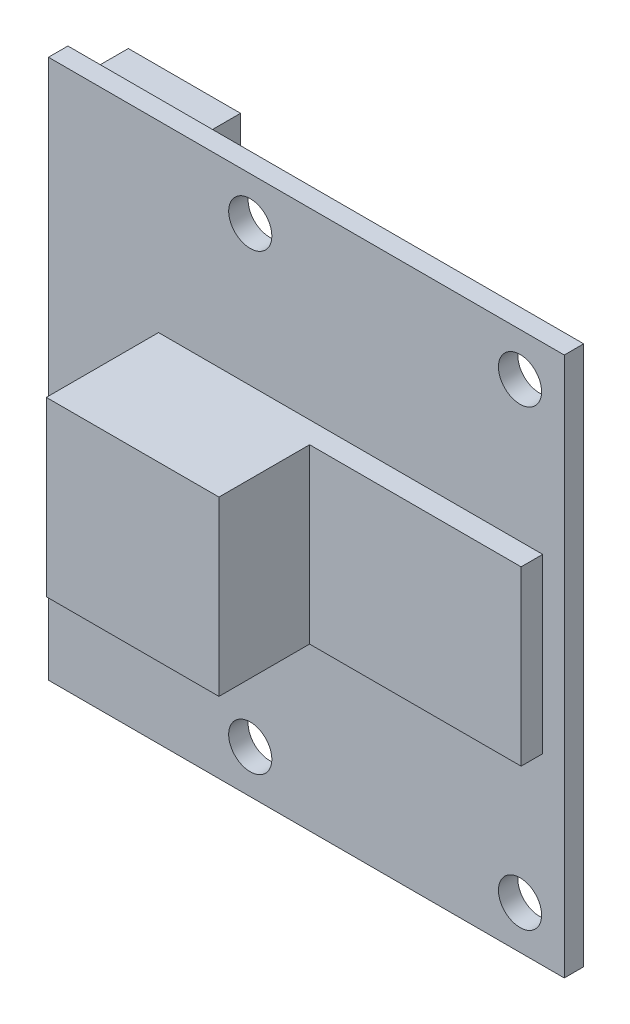
ISO-10303-21;
HEADER;
FILE_DESCRIPTION(('STEP AP214'),'2;1');
FILE_NAME('part.step','',(''),(''),'','','');
FILE_SCHEMA(('AUTOMOTIVE_DESIGN { 1 0 10303 214 1 1 1 1 }'));
ENDSEC;
DATA;
#1=APPLICATION_CONTEXT('core data for automotive mechanical design processes');
#2=APPLICATION_PROTOCOL_DEFINITION('international standard','automotive_design',2000,#1);
#3=PRODUCT_CONTEXT('',#1,'mechanical');
#4=PRODUCT('Part','Part','',(#3));
#5=PRODUCT_RELATED_PRODUCT_CATEGORY('part','',(#4));
#6=PRODUCT_DEFINITION_FORMATION('','',#4);
#7=PRODUCT_DEFINITION_CONTEXT('part definition',#1,'design');
#8=PRODUCT_DEFINITION('design','',#6,#7);
#9=PRODUCT_DEFINITION_SHAPE('','',#8);
#10=(LENGTH_UNIT() NAMED_UNIT(*) SI_UNIT(.MILLI.,.METRE.));
#11=(NAMED_UNIT(*) PLANE_ANGLE_UNIT() SI_UNIT($,.RADIAN.));
#12=(NAMED_UNIT(*) SI_UNIT($,.STERADIAN.) SOLID_ANGLE_UNIT());
#13=UNCERTAINTY_MEASURE_WITH_UNIT(LENGTH_MEASURE(1.E-05),#10,'distance_accuracy_value','');
#14=(GEOMETRIC_REPRESENTATION_CONTEXT(3) GLOBAL_UNCERTAINTY_ASSIGNED_CONTEXT((#13)) GLOBAL_UNIT_ASSIGNED_CONTEXT((#10,
#11,#12)) REPRESENTATION_CONTEXT('',''));
#15=CARTESIAN_POINT('',(0.,0.,0.));
#16=DIRECTION('',(0.,0.,1.));
#17=DIRECTION('',(1.,0.,0.));
#18=AXIS2_PLACEMENT_3D('',#15,#16,#17);
#19=CARTESIAN_POINT('',(0.,0.,0.));
#20=DIRECTION('',(0.,0.,1.));
#21=DIRECTION('',(1.,0.,0.));
#22=AXIS2_PLACEMENT_3D('',#19,#20,#21);
#23=PLANE('',#22);
#24=CARTESIAN_POINT('',(-2.15,-10.5,0.));
#25=DIRECTION('',(0.,0.,1.));
#26=DIRECTION('',(1.,0.,0.));
#27=AXIS2_PLACEMENT_3D('',#24,#25,#26);
#28=CIRCLE('',#27,0.999999999999993);
#29=CARTESIAN_POINT('',(-1.15000000000001,-10.5,0.));
#30=VERTEX_POINT('',#29);
#31=EDGE_CURVE('E544',#30,#30,#28,.T.);
#32=ORIENTED_EDGE('',*,*,#31,.T.);
#33=EDGE_LOOP('',(#32));
#34=FACE_BOUND('',#33,.T.);
#35=CARTESIAN_POINT('',(10.35,-10.5,0.));
#36=DIRECTION('',(0.,0.,1.));
#37=DIRECTION('',(1.,0.,0.));
#38=AXIS2_PLACEMENT_3D('',#35,#36,#37);
#39=CIRCLE('',#38,0.999999999999993);
#40=CARTESIAN_POINT('',(11.35,-10.5,0.));
#41=VERTEX_POINT('',#40);
#42=EDGE_CURVE('E163',#41,#41,#39,.T.);
#43=ORIENTED_EDGE('',*,*,#42,.T.);
#44=EDGE_LOOP('',(#43));
#45=FACE_BOUND('',#44,.T.);
#46=CARTESIAN_POINT('',(-2.15,10.5,0.));
#47=DIRECTION('',(0.,0.,1.));
#48=DIRECTION('',(1.,0.,0.));
#49=AXIS2_PLACEMENT_3D('',#46,#47,#48);
#50=CIRCLE('',#49,0.999999999999993);
#51=CARTESIAN_POINT('',(-1.15000000000001,10.5,0.));
#52=VERTEX_POINT('',#51);
#53=EDGE_CURVE('E198',#52,#52,#50,.T.);
#54=ORIENTED_EDGE('',*,*,#53,.T.);
#55=EDGE_LOOP('',(#54));
#56=FACE_BOUND('',#55,.T.);
#57=CARTESIAN_POINT('',(10.35,10.5,0.));
#58=DIRECTION('',(0.,0.,1.));
#59=DIRECTION('',(1.,0.,0.));
#60=AXIS2_PLACEMENT_3D('',#57,#58,#59);
#61=CIRCLE('',#60,0.999999999999993);
#62=CARTESIAN_POINT('',(11.35,10.5,0.));
#63=VERTEX_POINT('',#62);
#64=EDGE_CURVE('E204',#63,#63,#61,.T.);
#65=ORIENTED_EDGE('',*,*,#64,.T.);
#66=EDGE_LOOP('',(#65));
#67=FACE_BOUND('',#66,.T.);
#68=DIRECTION('',(1.,0.,0.));
#69=VECTOR('',#68,1.);
#70=CARTESIAN_POINT('',(-11.5,-11.,0.));
#71=LINE('',#70,#69);
#72=CARTESIAN_POINT('',(-11.5,-11.,0.));
#73=VERTEX_POINT('',#72);
#74=CARTESIAN_POINT('',(-6.3,-11.,0.));
#75=VERTEX_POINT('',#74);
#76=EDGE_CURVE('E160',#73,#75,#71,.T.);
#77=ORIENTED_EDGE('',*,*,#76,.T.);
#78=DIRECTION('',(0.,-1.,0.));
#79=VECTOR('',#78,1.);
#80=CARTESIAN_POINT('',(-6.3,0.,0.));
#81=LINE('',#80,#79);
#82=CARTESIAN_POINT('',(-6.3,11.,0.));
#83=VERTEX_POINT('',#82);
#84=EDGE_CURVE('E151',#83,#75,#81,.T.);
#85=ORIENTED_EDGE('',*,*,#84,.F.);
#86=DIRECTION('',(1.,0.,0.));
#87=VECTOR('',#86,1.);
#88=CARTESIAN_POINT('',(-11.5,11.,0.));
#89=LINE('',#88,#87);
#90=CARTESIAN_POINT('',(-11.5,11.,0.));
#91=VERTEX_POINT('',#90);
#92=EDGE_CURVE('E207',#91,#83,#89,.T.);
#93=ORIENTED_EDGE('',*,*,#92,.F.);
#94=DIRECTION('',(0.,-1.,0.));
#95=VECTOR('',#94,1.);
#96=CARTESIAN_POINT('',(-11.5,12.5,0.));
#97=LINE('',#96,#95);
#98=CARTESIAN_POINT('',(-11.5,12.5,0.));
#99=VERTEX_POINT('',#98);
#100=EDGE_CURVE('E232',#99,#91,#97,.T.);
#101=ORIENTED_EDGE('',*,*,#100,.F.);
#102=DIRECTION('',(-1.,0.,0.));
#103=VECTOR('',#102,1.);
#104=CARTESIAN_POINT('',(12.4,12.5,0.));
#105=LINE('',#104,#103);
#106=CARTESIAN_POINT('',(12.4,12.5,0.));
#107=VERTEX_POINT('',#106);
#108=EDGE_CURVE('E246',#107,#99,#105,.T.);
#109=ORIENTED_EDGE('',*,*,#108,.F.);
#110=DIRECTION('',(0.,1.,0.));
#111=VECTOR('',#110,1.);
#112=CARTESIAN_POINT('',(12.4,0.,0.));
#113=LINE('',#112,#111);
#114=CARTESIAN_POINT('',(12.4,-12.5,0.));
#115=VERTEX_POINT('',#114);
#116=EDGE_CURVE('E273',#115,#107,#113,.T.);
#117=ORIENTED_EDGE('',*,*,#116,.F.);
#118=DIRECTION('',(-1.,0.,0.));
#119=VECTOR('',#118,1.);
#120=CARTESIAN_POINT('',(12.4,-12.5,0.));
#121=LINE('',#120,#119);
#122=CARTESIAN_POINT('',(-11.5,-12.5,0.));
#123=VERTEX_POINT('',#122);
#124=EDGE_CURVE('E188',#115,#123,#121,.T.);
#125=ORIENTED_EDGE('',*,*,#124,.T.);
#126=DIRECTION('',(0.,1.,0.));
#127=VECTOR('',#126,1.);
#128=CARTESIAN_POINT('',(-11.5,-12.5,0.));
#129=LINE('',#128,#127);
#130=EDGE_CURVE('E183',#123,#73,#129,.T.);
#131=ORIENTED_EDGE('',*,*,#130,.T.);
#132=EDGE_LOOP('',(#77,#85,#93,#101,#109,#117,#125,#131));
#133=FACE_BOUND('',#132,.T.);
#134=ADVANCED_FACE('F32',(#34,#45,#56,#67,#133),#23,.F.);
#135=CARTESIAN_POINT('',(0.,0.,1.9));
#136=DIRECTION('',(0.,0.,-1.));
#137=DIRECTION('',(-1.,0.,0.));
#138=AXIS2_PLACEMENT_3D('',#135,#136,#137);
#139=PLANE('',#138);
#140=DIRECTION('',(0.,1.,0.));
#141=VECTOR('',#140,1.);
#142=CARTESIAN_POINT('',(1.6,0.,1.9));
#143=LINE('',#142,#141);
#144=CARTESIAN_POINT('',(1.6,-4.,1.9));
#145=VERTEX_POINT('',#144);
#146=CARTESIAN_POINT('',(1.6,4.,1.9));
#147=VERTEX_POINT('',#146);
#148=EDGE_CURVE('E235',#145,#147,#143,.T.);
#149=ORIENTED_EDGE('',*,*,#148,.F.);
#150=DIRECTION('',(-1.,0.,0.));
#151=VECTOR('',#150,1.);
#152=CARTESIAN_POINT('',(-6.4,-4.,1.9));
#153=LINE('',#152,#151);
#154=CARTESIAN_POINT('',(11.4,-4.,1.9));
#155=VERTEX_POINT('',#154);
#156=EDGE_CURVE('E174',#155,#145,#153,.T.);
#157=ORIENTED_EDGE('',*,*,#156,.F.);
#158=DIRECTION('',(0.,1.,0.));
#159=VECTOR('',#158,1.);
#160=CARTESIAN_POINT('',(11.4,4.,1.9));
#161=LINE('',#160,#159);
#162=CARTESIAN_POINT('',(11.4,4.,1.9));
#163=VERTEX_POINT('',#162);
#164=EDGE_CURVE('E262',#155,#163,#161,.T.);
#165=ORIENTED_EDGE('',*,*,#164,.T.);
#166=DIRECTION('',(-1.,0.,0.));
#167=VECTOR('',#166,1.);
#168=CARTESIAN_POINT('',(-6.4,4.,1.9));
#169=LINE('',#168,#167);
#170=EDGE_CURVE('E263',#163,#147,#169,.T.);
#171=ORIENTED_EDGE('',*,*,#170,.T.);
#172=EDGE_LOOP('',(#149,#157,#165,#171));
#173=FACE_BOUND('',#172,.T.);
#174=ADVANCED_FACE('F297',(#173),#139,.F.);
#175=CARTESIAN_POINT('',(12.4,0.,0.9));
#176=DIRECTION('',(-1.,0.,0.));
#177=DIRECTION('',(0.,-1.,0.));
#178=AXIS2_PLACEMENT_3D('',#175,#176,#177);
#179=PLANE('',#178);
#180=ORIENTED_EDGE('',*,*,#116,.T.);
#181=DIRECTION('',(0.,0.,-1.));
#182=VECTOR('',#181,1.);
#183=CARTESIAN_POINT('',(12.4,12.5,0.9));
#184=LINE('',#183,#182);
#185=CARTESIAN_POINT('',(12.4,12.5,0.9));
#186=VERTEX_POINT('',#185);
#187=EDGE_CURVE('E11',#186,#107,#184,.T.);
#188=ORIENTED_EDGE('',*,*,#187,.F.);
#189=DIRECTION('',(0.,1.,0.));
#190=VECTOR('',#189,1.);
#191=CARTESIAN_POINT('',(12.4,0.,0.9));
#192=LINE('',#191,#190);
#193=CARTESIAN_POINT('',(12.4,-12.5,0.9));
#194=VERTEX_POINT('',#193);
#195=EDGE_CURVE('E245',#194,#186,#192,.T.);
#196=ORIENTED_EDGE('',*,*,#195,.F.);
#197=DIRECTION('',(0.,0.,-1.));
#198=VECTOR('',#197,1.);
#199=CARTESIAN_POINT('',(12.4,-12.5,0.9));
#200=LINE('',#199,#198);
#201=EDGE_CURVE('E187',#194,#115,#200,.T.);
#202=ORIENTED_EDGE('',*,*,#201,.T.);
#203=EDGE_LOOP('',(#180,#188,#196,#202));
#204=FACE_BOUND('',#203,.T.);
#205=ADVANCED_FACE('F34',(#204),#179,.F.);
#206=CARTESIAN_POINT('',(12.4,12.5,0.9));
#207=DIRECTION('',(0.,-1.,0.));
#208=DIRECTION('',(1.,0.,0.));
#209=AXIS2_PLACEMENT_3D('',#206,#207,#208);
#210=PLANE('',#209);
#211=ORIENTED_EDGE('',*,*,#108,.T.);
#212=DIRECTION('',(0.,0.,-1.));
#213=VECTOR('',#212,1.);
#214=CARTESIAN_POINT('',(-11.5,12.5,0.9));
#215=LINE('',#214,#213);
#216=CARTESIAN_POINT('',(-11.5,12.5,0.9));
#217=VERTEX_POINT('',#216);
#218=EDGE_CURVE('E41',#217,#99,#215,.T.);
#219=ORIENTED_EDGE('',*,*,#218,.F.);
#220=DIRECTION('',(-1.,0.,0.));
#221=VECTOR('',#220,1.);
#222=CARTESIAN_POINT('',(12.4,12.5,0.9));
#223=LINE('',#222,#221);
#224=EDGE_CURVE('E276',#186,#217,#223,.T.);
#225=ORIENTED_EDGE('',*,*,#224,.F.);
#226=ORIENTED_EDGE('',*,*,#187,.T.);
#227=EDGE_LOOP('',(#211,#219,#225,#226));
#228=FACE_BOUND('',#227,.T.);
#229=ADVANCED_FACE('F283',(#228),#210,.F.);
#230=CARTESIAN_POINT('',(-11.5,12.5,0.9));
#231=DIRECTION('',(1.,0.,0.));
#232=DIRECTION('',(0.,1.,0.));
#233=AXIS2_PLACEMENT_3D('',#230,#231,#232);
#234=PLANE('',#233);
#235=DIRECTION('',(0.,1.,0.));
#236=VECTOR('',#235,1.);
#237=CARTESIAN_POINT('',(-11.5,0.,-2.8));
#238=LINE('',#237,#236);
#239=CARTESIAN_POINT('',(-11.5,-11.,-2.8));
#240=VERTEX_POINT('',#239);
#241=CARTESIAN_POINT('',(-11.5,11.,-2.8));
#242=VERTEX_POINT('',#241);
#243=EDGE_CURVE('E208',#240,#242,#238,.T.);
#244=ORIENTED_EDGE('',*,*,#243,.F.);
#245=DIRECTION('',(0.,0.,1.));
#246=VECTOR('',#245,1.);
#247=CARTESIAN_POINT('',(-11.5,-11.,-2.8));
#248=LINE('',#247,#246);
#249=EDGE_CURVE('E156',#240,#73,#248,.T.);
#250=ORIENTED_EDGE('',*,*,#249,.T.);
#251=ORIENTED_EDGE('',*,*,#130,.F.);
#252=DIRECTION('',(0.,0.,-1.));
#253=VECTOR('',#252,1.);
#254=CARTESIAN_POINT('',(-11.5,-12.5,0.9));
#255=LINE('',#254,#253);
#256=CARTESIAN_POINT('',(-11.5,-12.5,0.9));
#257=VERTEX_POINT('',#256);
#258=EDGE_CURVE('E193',#257,#123,#255,.T.);
#259=ORIENTED_EDGE('',*,*,#258,.F.);
#260=DIRECTION('',(0.,-1.,0.));
#261=VECTOR('',#260,1.);
#262=CARTESIAN_POINT('',(-11.5,12.5,0.9));
#263=LINE('',#262,#261);
#264=EDGE_CURVE('E253',#217,#257,#263,.T.);
#265=ORIENTED_EDGE('',*,*,#264,.F.);
#266=ORIENTED_EDGE('',*,*,#218,.T.);
#267=ORIENTED_EDGE('',*,*,#100,.T.);
#268=DIRECTION('',(0.,0.,1.));
#269=VECTOR('',#268,1.);
#270=CARTESIAN_POINT('',(-11.5,11.,-2.8));
#271=LINE('',#270,#269);
#272=EDGE_CURVE('E229',#242,#91,#271,.T.);
#273=ORIENTED_EDGE('',*,*,#272,.F.);
#274=EDGE_LOOP('',(#244,#250,#251,#259,#265,#266,#267,#273));
#275=FACE_BOUND('',#274,.T.);
#276=ADVANCED_FACE('F224',(#275),#234,.F.);
#277=CARTESIAN_POINT('',(0.,0.,0.9));
#278=DIRECTION('',(0.,0.,1.));
#279=DIRECTION('',(1.,0.,0.));
#280=AXIS2_PLACEMENT_3D('',#277,#278,#279);
#281=PLANE('',#280);
#282=CARTESIAN_POINT('',(-2.15,-10.5,0.900000000000001));
#283=DIRECTION('',(0.,0.,1.));
#284=DIRECTION('',(1.,0.,0.));
#285=AXIS2_PLACEMENT_3D('',#282,#283,#284);
#286=CIRCLE('',#285,0.999999999999987);
#287=CARTESIAN_POINT('',(-1.15000000000002,-10.5,0.900000000000001));
#288=VERTEX_POINT('',#287);
#289=EDGE_CURVE('E547',#288,#288,#286,.T.);
#290=ORIENTED_EDGE('',*,*,#289,.F.);
#291=EDGE_LOOP('',(#290));
#292=FACE_BOUND('',#291,.T.);
#293=CARTESIAN_POINT('',(10.35,-10.5,0.900000000000001));
#294=DIRECTION('',(0.,0.,1.));
#295=DIRECTION('',(1.,0.,0.));
#296=AXIS2_PLACEMENT_3D('',#293,#294,#295);
#297=CIRCLE('',#296,0.999999999999987);
#298=CARTESIAN_POINT('',(11.35,-10.5,0.900000000000001));
#299=VERTEX_POINT('',#298);
#300=EDGE_CURVE('E549',#299,#299,#297,.T.);
#301=ORIENTED_EDGE('',*,*,#300,.F.);
#302=EDGE_LOOP('',(#301));
#303=FACE_BOUND('',#302,.T.);
#304=DIRECTION('',(-1.,0.,0.));
#305=VECTOR('',#304,1.);
#306=CARTESIAN_POINT('',(-6.4,-4.,0.9));
#307=LINE('',#306,#305);
#308=CARTESIAN_POINT('',(11.4,-4.,0.9));
#309=VERTEX_POINT('',#308);
#310=CARTESIAN_POINT('',(-6.4,-4.,0.9));
#311=VERTEX_POINT('',#310);
#312=EDGE_CURVE('E173',#309,#311,#307,.T.);
#313=ORIENTED_EDGE('',*,*,#312,.T.);
#314=DIRECTION('',(0.,-1.,0.));
#315=VECTOR('',#314,1.);
#316=CARTESIAN_POINT('',(-6.4,0.,0.9));
#317=LINE('',#316,#315);
#318=CARTESIAN_POINT('',(-6.4,4.,0.9));
#319=VERTEX_POINT('',#318);
#320=EDGE_CURVE('E49',#319,#311,#317,.T.);
#321=ORIENTED_EDGE('',*,*,#320,.F.);
#322=DIRECTION('',(-1.,0.,0.));
#323=VECTOR('',#322,1.);
#324=CARTESIAN_POINT('',(-6.4,4.,0.9));
#325=LINE('',#324,#323);
#326=CARTESIAN_POINT('',(11.4,4.,0.9));
#327=VERTEX_POINT('',#326);
#328=EDGE_CURVE('E256',#327,#319,#325,.T.);
#329=ORIENTED_EDGE('',*,*,#328,.F.);
#330=DIRECTION('',(0.,1.,0.));
#331=VECTOR('',#330,1.);
#332=CARTESIAN_POINT('',(11.4,4.,0.9));
#333=LINE('',#332,#331);
#334=EDGE_CURVE('E56',#309,#327,#333,.T.);
#335=ORIENTED_EDGE('',*,*,#334,.F.);
#336=EDGE_LOOP('',(#313,#321,#329,#335));
#337=FACE_BOUND('',#336,.T.);
#338=CARTESIAN_POINT('',(-2.15,10.5,0.900000000000001));
#339=DIRECTION('',(0.,0.,1.));
#340=DIRECTION('',(1.,0.,0.));
#341=AXIS2_PLACEMENT_3D('',#338,#339,#340);
#342=CIRCLE('',#341,0.999999999999987);
#343=CARTESIAN_POINT('',(-1.15000000000002,10.5,0.900000000000001));
#344=VERTEX_POINT('',#343);
#345=EDGE_CURVE('E195',#344,#344,#342,.T.);
#346=ORIENTED_EDGE('',*,*,#345,.F.);
#347=EDGE_LOOP('',(#346));
#348=FACE_BOUND('',#347,.T.);
#349=CARTESIAN_POINT('',(10.35,10.5,0.900000000000001));
#350=DIRECTION('',(0.,0.,1.));
#351=DIRECTION('',(1.,0.,0.));
#352=AXIS2_PLACEMENT_3D('',#349,#350,#351);
#353=CIRCLE('',#352,0.999999999999987);
#354=CARTESIAN_POINT('',(11.35,10.5,0.900000000000001));
#355=VERTEX_POINT('',#354);
#356=EDGE_CURVE('E201',#355,#355,#353,.T.);
#357=ORIENTED_EDGE('',*,*,#356,.F.);
#358=EDGE_LOOP('',(#357));
#359=FACE_BOUND('',#358,.T.);
#360=ORIENTED_EDGE('',*,*,#264,.T.);
#361=DIRECTION('',(-1.,0.,0.));
#362=VECTOR('',#361,1.);
#363=CARTESIAN_POINT('',(12.4,-12.5,0.9));
#364=LINE('',#363,#362);
#365=EDGE_CURVE('E184',#194,#257,#364,.T.);
#366=ORIENTED_EDGE('',*,*,#365,.F.);
#367=ORIENTED_EDGE('',*,*,#195,.T.);
#368=ORIENTED_EDGE('',*,*,#224,.T.);
#369=EDGE_LOOP('',(#360,#366,#367,#368));
#370=FACE_BOUND('',#369,.T.);
#371=ADVANCED_FACE('F309',(#292,#303,#337,#348,#359,#370),#281,.T.);
#372=CARTESIAN_POINT('',(11.4,4.,1.9));
#373=DIRECTION('',(-1.,0.,0.));
#374=DIRECTION('',(0.,0.,1.));
#375=AXIS2_PLACEMENT_3D('',#372,#373,#374);
#376=PLANE('',#375);
#377=ORIENTED_EDGE('',*,*,#334,.T.);
#378=DIRECTION('',(0.,0.,-1.));
#379=VECTOR('',#378,1.);
#380=CARTESIAN_POINT('',(11.4,4.,1.9));
#381=LINE('',#380,#379);
#382=EDGE_CURVE('E270',#163,#327,#381,.T.);
#383=ORIENTED_EDGE('',*,*,#382,.F.);
#384=ORIENTED_EDGE('',*,*,#164,.F.);
#385=DIRECTION('',(0.,0.,-1.));
#386=VECTOR('',#385,1.);
#387=CARTESIAN_POINT('',(11.4,-4.,1.9));
#388=LINE('',#387,#386);
#389=EDGE_CURVE('E177',#155,#309,#388,.T.);
#390=ORIENTED_EDGE('',*,*,#389,.T.);
#391=EDGE_LOOP('',(#377,#383,#384,#390));
#392=FACE_BOUND('',#391,.T.);
#393=ADVANCED_FACE('F367',(#392),#376,.F.);
#394=CARTESIAN_POINT('',(-6.4,4.,1.9));
#395=DIRECTION('',(0.,-1.,0.));
#396=DIRECTION('',(0.,0.,-1.));
#397=AXIS2_PLACEMENT_3D('',#394,#395,#396);
#398=PLANE('',#397);
#399=ORIENTED_EDGE('',*,*,#328,.T.);
#400=DIRECTION('',(0.,0.,-1.));
#401=VECTOR('',#400,1.);
#402=CARTESIAN_POINT('',(-6.4,4.,1.9));
#403=LINE('',#402,#401);
#404=CARTESIAN_POINT('',(-6.4,4.,6.1));
#405=VERTEX_POINT('',#404);
#406=EDGE_CURVE('E268',#405,#319,#403,.T.);
#407=ORIENTED_EDGE('',*,*,#406,.F.);
#408=DIRECTION('',(-1.,0.,0.));
#409=VECTOR('',#408,1.);
#410=CARTESIAN_POINT('',(-6.4,4.,6.1));
#411=LINE('',#410,#409);
#412=CARTESIAN_POINT('',(1.6,4.,6.1));
#413=VERTEX_POINT('',#412);
#414=EDGE_CURVE('E527',#413,#405,#411,.T.);
#415=ORIENTED_EDGE('',*,*,#414,.F.);
#416=DIRECTION('',(0.,0.,-1.));
#417=VECTOR('',#416,1.);
#418=CARTESIAN_POINT('',(1.6,4.,6.1));
#419=LINE('',#418,#417);
#420=EDGE_CURVE('E257',#413,#147,#419,.T.);
#421=ORIENTED_EDGE('',*,*,#420,.T.);
#422=ORIENTED_EDGE('',*,*,#170,.F.);
#423=ORIENTED_EDGE('',*,*,#382,.T.);
#424=EDGE_LOOP('',(#399,#407,#415,#421,#422,#423));
#425=FACE_BOUND('',#424,.T.);
#426=ADVANCED_FACE('F362',(#425),#398,.F.);
#427=CARTESIAN_POINT('',(-6.4,0.,1.9));
#428=DIRECTION('',(1.,0.,0.));
#429=DIRECTION('',(0.,0.,-1.));
#430=AXIS2_PLACEMENT_3D('',#427,#428,#429);
#431=PLANE('',#430);
#432=ORIENTED_EDGE('',*,*,#320,.T.);
#433=DIRECTION('',(0.,0.,-1.));
#434=VECTOR('',#433,1.);
#435=CARTESIAN_POINT('',(-6.4,-4.,1.9));
#436=LINE('',#435,#434);
#437=CARTESIAN_POINT('',(-6.4,-4.,6.1));
#438=VERTEX_POINT('',#437);
#439=EDGE_CURVE('E180',#438,#311,#436,.T.);
#440=ORIENTED_EDGE('',*,*,#439,.F.);
#441=DIRECTION('',(0.,-1.,0.));
#442=VECTOR('',#441,1.);
#443=CARTESIAN_POINT('',(-6.4,0.,6.1));
#444=LINE('',#443,#442);
#445=EDGE_CURVE('E237',#405,#438,#444,.T.);
#446=ORIENTED_EDGE('',*,*,#445,.F.);
#447=ORIENTED_EDGE('',*,*,#406,.T.);
#448=EDGE_LOOP('',(#432,#440,#446,#447));
#449=FACE_BOUND('',#448,.T.);
#450=ADVANCED_FACE('F366',(#449),#431,.F.);
#451=CARTESIAN_POINT('',(1.6,0.,6.1));
#452=DIRECTION('',(-1.,0.,0.));
#453=DIRECTION('',(0.,0.,1.));
#454=AXIS2_PLACEMENT_3D('',#451,#452,#453);
#455=PLANE('',#454);
#456=ORIENTED_EDGE('',*,*,#148,.T.);
#457=ORIENTED_EDGE('',*,*,#420,.F.);
#458=DIRECTION('',(0.,1.,0.));
#459=VECTOR('',#458,1.);
#460=CARTESIAN_POINT('',(1.6,0.,6.1));
#461=LINE('',#460,#459);
#462=CARTESIAN_POINT('',(1.6,-4.,6.1));
#463=VERTEX_POINT('',#462);
#464=EDGE_CURVE('E526',#463,#413,#461,.T.);
#465=ORIENTED_EDGE('',*,*,#464,.F.);
#466=DIRECTION('',(0.,0.,-1.));
#467=VECTOR('',#466,1.);
#468=CARTESIAN_POINT('',(1.6,-4.,6.1));
#469=LINE('',#468,#467);
#470=EDGE_CURVE('E170',#463,#145,#469,.T.);
#471=ORIENTED_EDGE('',*,*,#470,.T.);
#472=EDGE_LOOP('',(#456,#457,#465,#471));
#473=FACE_BOUND('',#472,.T.);
#474=ADVANCED_FACE('F293',(#473),#455,.F.);
#475=CARTESIAN_POINT('',(0.,0.,6.1));
#476=DIRECTION('',(0.,0.,-1.));
#477=DIRECTION('',(-1.,0.,0.));
#478=AXIS2_PLACEMENT_3D('',#475,#476,#477);
#479=PLANE('',#478);
#480=ORIENTED_EDGE('',*,*,#445,.T.);
#481=DIRECTION('',(-1.,0.,0.));
#482=VECTOR('',#481,1.);
#483=CARTESIAN_POINT('',(-6.4,-4.,6.1));
#484=LINE('',#483,#482);
#485=EDGE_CURVE('E155',#463,#438,#484,.T.);
#486=ORIENTED_EDGE('',*,*,#485,.F.);
#487=ORIENTED_EDGE('',*,*,#464,.T.);
#488=ORIENTED_EDGE('',*,*,#414,.T.);
#489=EDGE_LOOP('',(#480,#486,#487,#488));
#490=FACE_BOUND('',#489,.T.);
#491=ADVANCED_FACE('F286',(#490),#479,.F.);
#492=CARTESIAN_POINT('',(-11.5,11.,-2.8));
#493=DIRECTION('',(0.,-1.,0.));
#494=DIRECTION('',(1.,0.,0.));
#495=AXIS2_PLACEMENT_3D('',#492,#493,#494);
#496=PLANE('',#495);
#497=ORIENTED_EDGE('',*,*,#92,.T.);
#498=DIRECTION('',(0.,0.,1.));
#499=VECTOR('',#498,1.);
#500=CARTESIAN_POINT('',(-6.3,11.,-2.8));
#501=LINE('',#500,#499);
#502=CARTESIAN_POINT('',(-6.3,11.,-2.8));
#503=VERTEX_POINT('',#502);
#504=EDGE_CURVE('E146',#503,#83,#501,.T.);
#505=ORIENTED_EDGE('',*,*,#504,.F.);
#506=DIRECTION('',(1.,0.,0.));
#507=VECTOR('',#506,1.);
#508=CARTESIAN_POINT('',(-11.5,11.,-2.8));
#509=LINE('',#508,#507);
#510=EDGE_CURVE('E142',#242,#503,#509,.T.);
#511=ORIENTED_EDGE('',*,*,#510,.F.);
#512=ORIENTED_EDGE('',*,*,#272,.T.);
#513=EDGE_LOOP('',(#497,#505,#511,#512));
#514=FACE_BOUND('',#513,.T.);
#515=ADVANCED_FACE('F284',(#514),#496,.F.);
#516=CARTESIAN_POINT('',(-6.3,0.,-2.8));
#517=DIRECTION('',(-1.,0.,0.));
#518=DIRECTION('',(0.,0.,1.));
#519=AXIS2_PLACEMENT_3D('',#516,#517,#518);
#520=PLANE('',#519);
#521=ORIENTED_EDGE('',*,*,#84,.T.);
#522=DIRECTION('',(0.,0.,1.));
#523=VECTOR('',#522,1.);
#524=CARTESIAN_POINT('',(-6.3,-11.,-2.8));
#525=LINE('',#524,#523);
#526=CARTESIAN_POINT('',(-6.3,-11.,-2.8));
#527=VERTEX_POINT('',#526);
#528=EDGE_CURVE('E149',#527,#75,#525,.T.);
#529=ORIENTED_EDGE('',*,*,#528,.F.);
#530=DIRECTION('',(0.,-1.,0.));
#531=VECTOR('',#530,1.);
#532=CARTESIAN_POINT('',(-6.3,0.,-2.8));
#533=LINE('',#532,#531);
#534=EDGE_CURVE('E136',#503,#527,#533,.T.);
#535=ORIENTED_EDGE('',*,*,#534,.F.);
#536=ORIENTED_EDGE('',*,*,#504,.T.);
#537=EDGE_LOOP('',(#521,#529,#535,#536));
#538=FACE_BOUND('',#537,.T.);
#539=ADVANCED_FACE('F150',(#538),#520,.F.);
#540=CARTESIAN_POINT('',(0.,0.,-2.8));
#541=DIRECTION('',(0.,0.,-1.));
#542=DIRECTION('',(-1.,0.,0.));
#543=AXIS2_PLACEMENT_3D('',#540,#541,#542);
#544=PLANE('',#543);
#545=ORIENTED_EDGE('',*,*,#243,.T.);
#546=ORIENTED_EDGE('',*,*,#510,.T.);
#547=ORIENTED_EDGE('',*,*,#534,.T.);
#548=DIRECTION('',(1.,0.,0.));
#549=VECTOR('',#548,1.);
#550=CARTESIAN_POINT('',(-11.5,-11.,-2.8));
#551=LINE('',#550,#549);
#552=EDGE_CURVE('E141',#240,#527,#551,.T.);
#553=ORIENTED_EDGE('',*,*,#552,.F.);
#554=EDGE_LOOP('',(#545,#546,#547,#553));
#555=FACE_BOUND('',#554,.T.);
#556=ADVANCED_FACE('F139',(#555),#544,.T.);
#557=CARTESIAN_POINT('',(10.35,10.5,0.9));
#558=DIRECTION('',(0.,0.,1.));
#559=DIRECTION('',(1.,0.,0.));
#560=AXIS2_PLACEMENT_3D('',#557,#558,#559);
#561=CYLINDRICAL_SURFACE('',#560,0.999999999999993);
#562=ORIENTED_EDGE('',*,*,#64,.F.);
#563=EDGE_LOOP('',(#562));
#564=FACE_BOUND('',#563,.T.);
#565=ORIENTED_EDGE('',*,*,#356,.T.);
#566=EDGE_LOOP('',(#565));
#567=FACE_BOUND('',#566,.T.);
#568=ADVANCED_FACE('F337',(#564,#567),#561,.F.);
#569=CARTESIAN_POINT('',(-2.15,10.5,0.9));
#570=DIRECTION('',(0.,0.,1.));
#571=DIRECTION('',(1.,0.,0.));
#572=AXIS2_PLACEMENT_3D('',#569,#570,#571);
#573=CYLINDRICAL_SURFACE('',#572,0.999999999999993);
#574=ORIENTED_EDGE('',*,*,#53,.F.);
#575=EDGE_LOOP('',(#574));
#576=FACE_BOUND('',#575,.T.);
#577=ORIENTED_EDGE('',*,*,#345,.T.);
#578=EDGE_LOOP('',(#577));
#579=FACE_BOUND('',#578,.T.);
#580=ADVANCED_FACE('F331',(#576,#579),#573,.F.);
#581=CARTESIAN_POINT('',(12.4,-12.5,0.9));
#582=DIRECTION('',(0.,-1.,0.));
#583=DIRECTION('',(1.,0.,0.));
#584=AXIS2_PLACEMENT_3D('',#581,#582,#583);
#585=PLANE('',#584);
#586=ORIENTED_EDGE('',*,*,#124,.F.);
#587=ORIENTED_EDGE('',*,*,#201,.F.);
#588=ORIENTED_EDGE('',*,*,#365,.T.);
#589=ORIENTED_EDGE('',*,*,#258,.T.);
#590=EDGE_LOOP('',(#586,#587,#588,#589));
#591=FACE_BOUND('',#590,.T.);
#592=ADVANCED_FACE('F336',(#591),#585,.T.);
#593=CARTESIAN_POINT('',(-6.4,-4.,1.9));
#594=DIRECTION('',(0.,-1.,0.));
#595=DIRECTION('',(0.,0.,-1.));
#596=AXIS2_PLACEMENT_3D('',#593,#594,#595);
#597=PLANE('',#596);
#598=ORIENTED_EDGE('',*,*,#312,.F.);
#599=ORIENTED_EDGE('',*,*,#389,.F.);
#600=ORIENTED_EDGE('',*,*,#156,.T.);
#601=ORIENTED_EDGE('',*,*,#470,.F.);
#602=ORIENTED_EDGE('',*,*,#485,.T.);
#603=ORIENTED_EDGE('',*,*,#439,.T.);
#604=EDGE_LOOP('',(#598,#599,#600,#601,#602,#603));
#605=FACE_BOUND('',#604,.T.);
#606=ADVANCED_FACE('F455',(#605),#597,.T.);
#607=CARTESIAN_POINT('',(-11.5,-11.,-2.8));
#608=DIRECTION('',(0.,-1.,0.));
#609=DIRECTION('',(1.,0.,0.));
#610=AXIS2_PLACEMENT_3D('',#607,#608,#609);
#611=PLANE('',#610);
#612=ORIENTED_EDGE('',*,*,#76,.F.);
#613=ORIENTED_EDGE('',*,*,#249,.F.);
#614=ORIENTED_EDGE('',*,*,#552,.T.);
#615=ORIENTED_EDGE('',*,*,#528,.T.);
#616=EDGE_LOOP('',(#612,#613,#614,#615));
#617=FACE_BOUND('',#616,.T.);
#618=ADVANCED_FACE('F159',(#617),#611,.T.);
#619=CARTESIAN_POINT('',(10.35,-10.5,0.9));
#620=DIRECTION('',(0.,0.,1.));
#621=DIRECTION('',(1.,0.,0.));
#622=AXIS2_PLACEMENT_3D('',#619,#620,#621);
#623=CYLINDRICAL_SURFACE('',#622,0.999999999999993);
#624=ORIENTED_EDGE('',*,*,#42,.F.);
#625=EDGE_LOOP('',(#624));
#626=FACE_BOUND('',#625,.T.);
#627=ORIENTED_EDGE('',*,*,#300,.T.);
#628=EDGE_LOOP('',(#627));
#629=FACE_BOUND('',#628,.T.);
#630=ADVANCED_FACE('F479',(#626,#629),#623,.F.);
#631=CARTESIAN_POINT('',(-2.15,-10.5,0.9));
#632=DIRECTION('',(0.,0.,1.));
#633=DIRECTION('',(1.,0.,0.));
#634=AXIS2_PLACEMENT_3D('',#631,#632,#633);
#635=CYLINDRICAL_SURFACE('',#634,0.999999999999993);
#636=ORIENTED_EDGE('',*,*,#31,.F.);
#637=EDGE_LOOP('',(#636));
#638=FACE_BOUND('',#637,.T.);
#639=ORIENTED_EDGE('',*,*,#289,.T.);
#640=EDGE_LOOP('',(#639));
#641=FACE_BOUND('',#640,.T.);
#642=ADVANCED_FACE('F487',(#638,#641),#635,.F.);
#643=CLOSED_SHELL('',(#134,#174,#205,#229,#276,#371,#393,#426,#450,#474,#491,#515,#539,#556,
#568,#580,#592,#606,#618,#630,#642));
#644=MANIFOLD_SOLID_BREP('B2',#643);
#645=ADVANCED_BREP_SHAPE_REPRESENTATION('',(#18,#644),#14);
#646=SHAPE_DEFINITION_REPRESENTATION(#9,#645);
ENDSEC;
END-ISO-10303-21;
